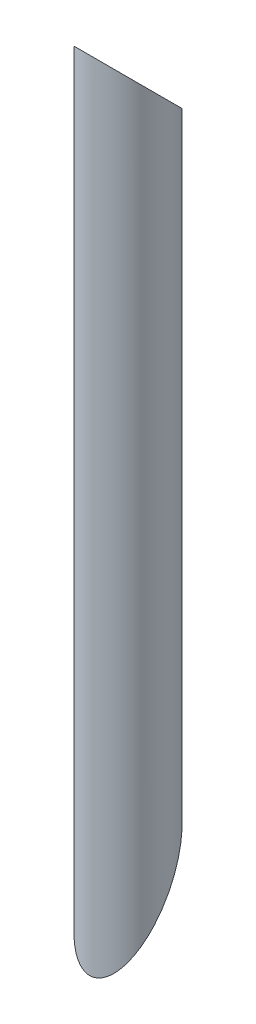
ISO-10303-21;
HEADER;
FILE_DESCRIPTION(('STEP AP214'),'2;1');
FILE_NAME('part.step','',(''),(''),'','','');
FILE_SCHEMA(('AUTOMOTIVE_DESIGN { 1 0 10303 214 1 1 1 1 }'));
ENDSEC;
DATA;
#1=APPLICATION_CONTEXT('core data for automotive mechanical design processes');
#2=APPLICATION_PROTOCOL_DEFINITION('international standard','automotive_design',2000,#1);
#3=PRODUCT_CONTEXT('',#1,'mechanical');
#4=PRODUCT('Part','Part','',(#3));
#5=PRODUCT_RELATED_PRODUCT_CATEGORY('part','',(#4));
#6=PRODUCT_DEFINITION_FORMATION('','',#4);
#7=PRODUCT_DEFINITION_CONTEXT('part definition',#1,'design');
#8=PRODUCT_DEFINITION('design','',#6,#7);
#9=PRODUCT_DEFINITION_SHAPE('','',#8);
#10=(LENGTH_UNIT() NAMED_UNIT(*) SI_UNIT(.MILLI.,.METRE.));
#11=(NAMED_UNIT(*) PLANE_ANGLE_UNIT() SI_UNIT($,.RADIAN.));
#12=(NAMED_UNIT(*) SI_UNIT($,.STERADIAN.) SOLID_ANGLE_UNIT());
#13=UNCERTAINTY_MEASURE_WITH_UNIT(LENGTH_MEASURE(1.E-05),#10,'distance_accuracy_value','');
#14=(GEOMETRIC_REPRESENTATION_CONTEXT(3) GLOBAL_UNCERTAINTY_ASSIGNED_CONTEXT((#13)) GLOBAL_UNIT_ASSIGNED_CONTEXT((#10,
#11,#12)) REPRESENTATION_CONTEXT('',''));
#15=CARTESIAN_POINT('',(0.,0.,0.));
#16=DIRECTION('',(0.,0.,1.));
#17=DIRECTION('',(1.,0.,0.));
#18=AXIS2_PLACEMENT_3D('',#15,#16,#17);
#19=CARTESIAN_POINT('',(0.,132.08,0.));
#20=DIRECTION('',(0.,-1.,0.));
#21=DIRECTION('',(0.,0.,-1.));
#22=AXIS2_PLACEMENT_3D('',#19,#20,#21);
#23=CYLINDRICAL_SURFACE('',#22,4.7625);
#24=CARTESIAN_POINT('',(0.,125.73,0.));
#25=DIRECTION('',(0.,-0.707106781186551,0.707106781186544));
#26=DIRECTION('',(0.,-0.707106781186544,-0.707106781186551));
#27=AXIS2_PLACEMENT_3D('',#24,#25,#26);
#28=ELLIPSE('',#27,6.73519209080183,4.7625);
#29=CARTESIAN_POINT('',(0.,120.9675,-4.7625));
#30=VERTEX_POINT('',#29);
#31=EDGE_CURVE('E34',#30,#30,#28,.T.);
#32=ORIENTED_EDGE('',*,*,#31,.F.);
#33=EDGE_LOOP('',(#32));
#34=FACE_BOUND('',#33,.T.);
#35=CARTESIAN_POINT('',(0.,10.9985226280625,0.));
#36=DIRECTION('',(0.,0.499999999999995,0.866025403784442));
#37=DIRECTION('',(0.,-0.866025403784442,0.499999999999995));
#38=AXIS2_PLACEMENT_3D('',#35,#36,#37);
#39=ELLIPSE('',#38,9.52500000000011,4.7625);
#40=CARTESIAN_POINT('',(0.,2.74963065701563,4.7625));
#41=VERTEX_POINT('',#40);
#42=EDGE_CURVE('E44',#41,#41,#39,.T.);
#43=ORIENTED_EDGE('',*,*,#42,.F.);
#44=EDGE_LOOP('',(#43));
#45=FACE_BOUND('',#44,.T.);
#46=ADVANCED_FACE('F30',(#34,#45),#23,.F.);
#47=CARTESIAN_POINT('',(-66.04,0.,6.35));
#48=DIRECTION('',(0.,0.499999999999995,0.866025403784442));
#49=DIRECTION('',(0.,-0.866025403784442,0.499999999999995));
#50=AXIS2_PLACEMENT_3D('',#47,#48,#49);
#51=PLANE('',#50);
#52=ORIENTED_EDGE('',*,*,#42,.T.);
#53=EDGE_LOOP('',(#52));
#54=FACE_BOUND('',#53,.T.);
#55=CARTESIAN_POINT('',(0.,10.9985226280625,0.));
#56=DIRECTION('',(0.,0.499999999999995,0.866025403784442));
#57=DIRECTION('',(0.,-0.866025403784442,0.499999999999995));
#58=AXIS2_PLACEMENT_3D('',#55,#56,#57);
#59=ELLIPSE('',#58,12.7000000000001,6.35);
#60=CARTESIAN_POINT('',(0.,0.,6.35));
#61=VERTEX_POINT('',#60);
#62=EDGE_CURVE('E42',#61,#61,#59,.T.);
#63=ORIENTED_EDGE('',*,*,#62,.F.);
#64=EDGE_LOOP('',(#63));
#65=FACE_BOUND('',#64,.T.);
#66=ADVANCED_FACE('F52',(#54,#65),#51,.F.);
#67=CARTESIAN_POINT('',(-66.04,132.08,6.35));
#68=DIRECTION('',(0.,-0.707106781186551,0.707106781186544));
#69=DIRECTION('',(0.,-0.707106781186544,-0.707106781186551));
#70=AXIS2_PLACEMENT_3D('',#67,#68,#69);
#71=PLANE('',#70);
#72=ORIENTED_EDGE('',*,*,#31,.T.);
#73=EDGE_LOOP('',(#72));
#74=FACE_BOUND('',#73,.T.);
#75=CARTESIAN_POINT('',(0.,125.73,0.));
#76=DIRECTION('',(0.,-0.707106781186551,0.707106781186544));
#77=DIRECTION('',(0.,-0.707106781186544,-0.707106781186551));
#78=AXIS2_PLACEMENT_3D('',#75,#76,#77);
#79=ELLIPSE('',#78,8.98025612106911,6.35);
#80=CARTESIAN_POINT('',(0.,119.38,-6.35));
#81=VERTEX_POINT('',#80);
#82=EDGE_CURVE('E10',#81,#81,#79,.T.);
#83=ORIENTED_EDGE('',*,*,#82,.F.);
#84=EDGE_LOOP('',(#83));
#85=FACE_BOUND('',#84,.T.);
#86=ADVANCED_FACE('F54',(#74,#85),#71,.F.);
#87=CARTESIAN_POINT('',(0.,132.08,0.));
#88=DIRECTION('',(0.,-1.,0.));
#89=DIRECTION('',(0.,0.,-1.));
#90=AXIS2_PLACEMENT_3D('',#87,#88,#89);
#91=CYLINDRICAL_SURFACE('',#90,6.35);
#92=ORIENTED_EDGE('',*,*,#82,.T.);
#93=EDGE_LOOP('',(#92));
#94=FACE_BOUND('',#93,.T.);
#95=ORIENTED_EDGE('',*,*,#62,.T.);
#96=EDGE_LOOP('',(#95));
#97=FACE_BOUND('',#96,.T.);
#98=ADVANCED_FACE('F32',(#94,#97),#91,.T.);
#99=CLOSED_SHELL('',(#46,#66,#86,#98));
#100=MANIFOLD_SOLID_BREP('B2',#99);
#101=ADVANCED_BREP_SHAPE_REPRESENTATION('',(#18,#100),#14);
#102=SHAPE_DEFINITION_REPRESENTATION(#9,#101);
ENDSEC;
END-ISO-10303-21;
